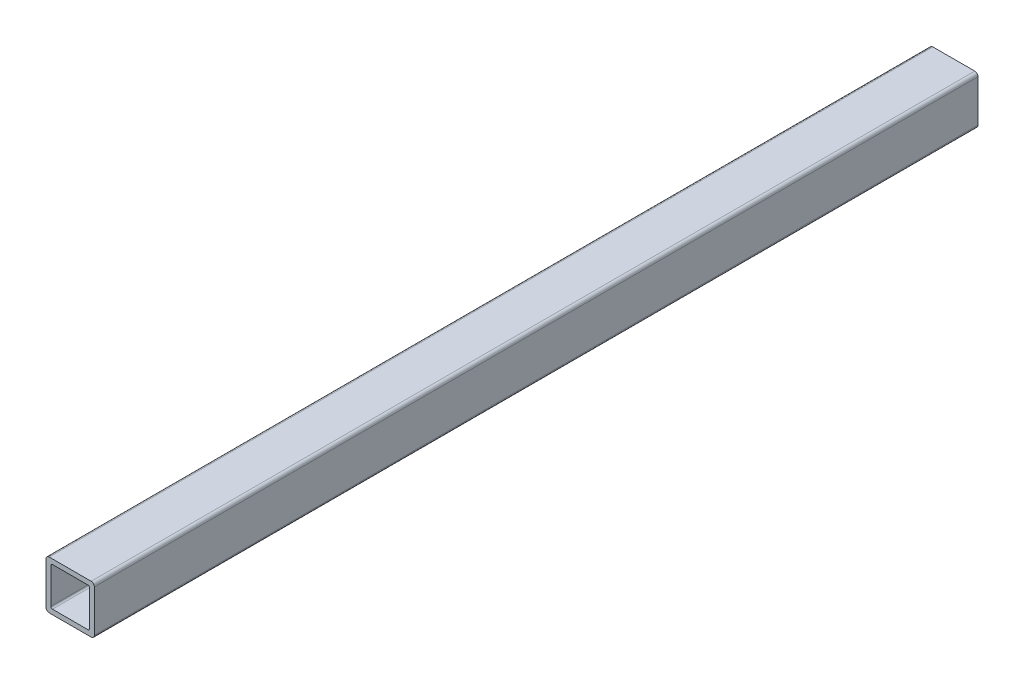
ISO-10303-21;
HEADER;
FILE_DESCRIPTION(('STEP AP214'),'2;1');
FILE_NAME('part.step','',(''),(''),'','','');
FILE_SCHEMA(('AUTOMOTIVE_DESIGN { 1 0 10303 214 1 1 1 1 }'));
ENDSEC;
DATA;
#1=APPLICATION_CONTEXT('core data for automotive mechanical design processes');
#2=APPLICATION_PROTOCOL_DEFINITION('international standard','automotive_design',2000,#1);
#3=PRODUCT_CONTEXT('',#1,'mechanical');
#4=PRODUCT('Part','Part','',(#3));
#5=PRODUCT_RELATED_PRODUCT_CATEGORY('part','',(#4));
#6=PRODUCT_DEFINITION_FORMATION('','',#4);
#7=PRODUCT_DEFINITION_CONTEXT('part definition',#1,'design');
#8=PRODUCT_DEFINITION('design','',#6,#7);
#9=PRODUCT_DEFINITION_SHAPE('','',#8);
#10=(LENGTH_UNIT() NAMED_UNIT(*) SI_UNIT(.MILLI.,.METRE.));
#11=(NAMED_UNIT(*) PLANE_ANGLE_UNIT() SI_UNIT($,.RADIAN.));
#12=(NAMED_UNIT(*) SI_UNIT($,.STERADIAN.) SOLID_ANGLE_UNIT());
#13=UNCERTAINTY_MEASURE_WITH_UNIT(LENGTH_MEASURE(1.E-05),#10,'distance_accuracy_value','');
#14=(GEOMETRIC_REPRESENTATION_CONTEXT(3) GLOBAL_UNCERTAINTY_ASSIGNED_CONTEXT((#13)) GLOBAL_UNIT_ASSIGNED_CONTEXT((#10,
#11,#12)) REPRESENTATION_CONTEXT('',''));
#15=CARTESIAN_POINT('',(0.,0.,0.));
#16=DIRECTION('',(0.,0.,1.));
#17=DIRECTION('',(1.,0.,0.));
#18=AXIS2_PLACEMENT_3D('',#15,#16,#17);
#19=CARTESIAN_POINT('',(2.,2.,548.));
#20=DIRECTION('',(0.,0.,1.));
#21=DIRECTION('',(1.,0.,0.));
#22=AXIS2_PLACEMENT_3D('',#19,#20,#21);
#23=PLANE('',#22);
#24=CARTESIAN_POINT('',(2.,2.,548.));
#25=DIRECTION('',(0.,0.,1.));
#26=DIRECTION('',(1.,0.,0.));
#27=AXIS2_PLACEMENT_3D('',#24,#25,#26);
#28=CIRCLE('',#27,2.);
#29=CARTESIAN_POINT('',(0.,2.00000000000001,548.));
#30=VERTEX_POINT('',#29);
#31=CARTESIAN_POINT('',(2.00000000000001,0.,548.));
#32=VERTEX_POINT('',#31);
#33=EDGE_CURVE('E214',#30,#32,#28,.T.);
#34=ORIENTED_EDGE('',*,*,#33,.T.);
#35=DIRECTION('',(1.,0.,0.));
#36=VECTOR('',#35,1.);
#37=CARTESIAN_POINT('',(2.00000000000001,0.,548.));
#38=LINE('',#37,#36);
#39=CARTESIAN_POINT('',(28.,0.,548.));
#40=VERTEX_POINT('',#39);
#41=EDGE_CURVE('E217',#32,#40,#38,.T.);
#42=ORIENTED_EDGE('',*,*,#41,.T.);
#43=CARTESIAN_POINT('',(28.,2.,548.));
#44=DIRECTION('',(0.,0.,1.));
#45=DIRECTION('',(1.,0.,0.));
#46=AXIS2_PLACEMENT_3D('',#43,#44,#45);
#47=CIRCLE('',#46,2.);
#48=CARTESIAN_POINT('',(30.,2.00000000000001,548.));
#49=VERTEX_POINT('',#48);
#50=EDGE_CURVE('E220',#40,#49,#47,.T.);
#51=ORIENTED_EDGE('',*,*,#50,.T.);
#52=DIRECTION('',(0.,1.,0.));
#53=VECTOR('',#52,1.);
#54=CARTESIAN_POINT('',(30.,2.00000000000001,548.));
#55=LINE('',#54,#53);
#56=CARTESIAN_POINT('',(30.,28.,548.));
#57=VERTEX_POINT('',#56);
#58=EDGE_CURVE('E222',#49,#57,#55,.T.);
#59=ORIENTED_EDGE('',*,*,#58,.T.);
#60=CARTESIAN_POINT('',(28.,28.,548.));
#61=DIRECTION('',(0.,0.,1.));
#62=DIRECTION('',(1.,0.,0.));
#63=AXIS2_PLACEMENT_3D('',#60,#61,#62);
#64=CIRCLE('',#63,2.);
#65=CARTESIAN_POINT('',(28.,30.,548.));
#66=VERTEX_POINT('',#65);
#67=EDGE_CURVE('E224',#57,#66,#64,.T.);
#68=ORIENTED_EDGE('',*,*,#67,.T.);
#69=DIRECTION('',(-1.,0.,0.));
#70=VECTOR('',#69,1.);
#71=CARTESIAN_POINT('',(2.00000000000001,30.,548.));
#72=LINE('',#71,#70);
#73=CARTESIAN_POINT('',(2.00000000000001,30.,548.));
#74=VERTEX_POINT('',#73);
#75=EDGE_CURVE('E226',#66,#74,#72,.T.);
#76=ORIENTED_EDGE('',*,*,#75,.T.);
#77=CARTESIAN_POINT('',(2.,28.,548.));
#78=DIRECTION('',(0.,0.,1.));
#79=DIRECTION('',(1.,0.,0.));
#80=AXIS2_PLACEMENT_3D('',#77,#78,#79);
#81=CIRCLE('',#80,2.);
#82=CARTESIAN_POINT('',(0.,28.,548.));
#83=VERTEX_POINT('',#82);
#84=EDGE_CURVE('E228',#74,#83,#81,.T.);
#85=ORIENTED_EDGE('',*,*,#84,.T.);
#86=DIRECTION('',(0.,-1.,0.));
#87=VECTOR('',#86,1.);
#88=CARTESIAN_POINT('',(0.,2.00000000000001,548.));
#89=LINE('',#88,#87);
#90=EDGE_CURVE('E230',#83,#30,#89,.T.);
#91=ORIENTED_EDGE('',*,*,#90,.T.);
#92=EDGE_LOOP('',(#34,#42,#51,#59,#68,#76,#85,#91));
#93=FACE_BOUND('',#92,.T.);
#94=DIRECTION('',(1.,0.,0.));
#95=VECTOR('',#94,1.);
#96=CARTESIAN_POINT('',(4.00000000000001,3.,548.));
#97=LINE('',#96,#95);
#98=CARTESIAN_POINT('',(4.00000000000001,3.,548.));
#99=VERTEX_POINT('',#98);
#100=CARTESIAN_POINT('',(26.,3.,548.));
#101=VERTEX_POINT('',#100);
#102=EDGE_CURVE('E157',#99,#101,#97,.T.);
#103=ORIENTED_EDGE('',*,*,#102,.F.);
#104=CARTESIAN_POINT('',(4.,4.,548.));
#105=DIRECTION('',(0.,0.,1.));
#106=DIRECTION('',(1.,0.,0.));
#107=AXIS2_PLACEMENT_3D('',#104,#105,#106);
#108=CIRCLE('',#107,1.);
#109=CARTESIAN_POINT('',(3.,4.00000000000001,548.));
#110=VERTEX_POINT('',#109);
#111=EDGE_CURVE('E149',#110,#99,#108,.T.);
#112=ORIENTED_EDGE('',*,*,#111,.F.);
#113=DIRECTION('',(0.,-1.,0.));
#114=VECTOR('',#113,1.);
#115=CARTESIAN_POINT('',(3.,4.00000000000001,548.));
#116=LINE('',#115,#114);
#117=CARTESIAN_POINT('',(3.,26.,548.));
#118=VERTEX_POINT('',#117);
#119=EDGE_CURVE('E182',#118,#110,#116,.T.);
#120=ORIENTED_EDGE('',*,*,#119,.F.);
#121=CARTESIAN_POINT('',(4.,26.,548.));
#122=DIRECTION('',(0.,0.,1.));
#123=DIRECTION('',(1.,0.,0.));
#124=AXIS2_PLACEMENT_3D('',#121,#122,#123);
#125=CIRCLE('',#124,1.);
#126=CARTESIAN_POINT('',(4.00000000000001,27.,548.));
#127=VERTEX_POINT('',#126);
#128=EDGE_CURVE('E180',#127,#118,#125,.T.);
#129=ORIENTED_EDGE('',*,*,#128,.F.);
#130=DIRECTION('',(-1.,0.,0.));
#131=VECTOR('',#130,1.);
#132=CARTESIAN_POINT('',(4.00000000000001,27.,548.));
#133=LINE('',#132,#131);
#134=CARTESIAN_POINT('',(26.,27.,548.));
#135=VERTEX_POINT('',#134);
#136=EDGE_CURVE('E178',#135,#127,#133,.T.);
#137=ORIENTED_EDGE('',*,*,#136,.F.);
#138=CARTESIAN_POINT('',(26.,26.,548.));
#139=DIRECTION('',(0.,0.,1.));
#140=DIRECTION('',(1.,0.,0.));
#141=AXIS2_PLACEMENT_3D('',#138,#139,#140);
#142=CIRCLE('',#141,1.);
#143=CARTESIAN_POINT('',(27.,26.,548.));
#144=VERTEX_POINT('',#143);
#145=EDGE_CURVE('E176',#144,#135,#142,.T.);
#146=ORIENTED_EDGE('',*,*,#145,.F.);
#147=DIRECTION('',(0.,1.,0.));
#148=VECTOR('',#147,1.);
#149=CARTESIAN_POINT('',(27.,4.00000000000001,548.));
#150=LINE('',#149,#148);
#151=CARTESIAN_POINT('',(27.,4.00000000000001,548.));
#152=VERTEX_POINT('',#151);
#153=EDGE_CURVE('E172',#152,#144,#150,.T.);
#154=ORIENTED_EDGE('',*,*,#153,.F.);
#155=CARTESIAN_POINT('',(26.,4.,548.));
#156=DIRECTION('',(0.,0.,1.));
#157=DIRECTION('',(1.,0.,0.));
#158=AXIS2_PLACEMENT_3D('',#155,#156,#157);
#159=CIRCLE('',#158,1.);
#160=EDGE_CURVE('E170',#101,#152,#159,.T.);
#161=ORIENTED_EDGE('',*,*,#160,.F.);
#162=EDGE_LOOP('',(#103,#112,#120,#129,#137,#146,#154,#161));
#163=FACE_BOUND('',#162,.T.);
#164=ADVANCED_FACE('F36',(#93,#163),#23,.T.);
#165=CARTESIAN_POINT('',(2.,2.,0.));
#166=DIRECTION('',(0.,0.,1.));
#167=DIRECTION('',(1.,0.,0.));
#168=AXIS2_PLACEMENT_3D('',#165,#166,#167);
#169=PLANE('',#168);
#170=CARTESIAN_POINT('',(2.,2.,0.));
#171=DIRECTION('',(0.,0.,1.));
#172=DIRECTION('',(1.,0.,0.));
#173=AXIS2_PLACEMENT_3D('',#170,#171,#172);
#174=CIRCLE('',#173,2.);
#175=CARTESIAN_POINT('',(0.,2.00000000000001,0.));
#176=VERTEX_POINT('',#175);
#177=CARTESIAN_POINT('',(2.00000000000001,0.,0.));
#178=VERTEX_POINT('',#177);
#179=EDGE_CURVE('E165',#176,#178,#174,.T.);
#180=ORIENTED_EDGE('',*,*,#179,.F.);
#181=DIRECTION('',(0.,-1.,0.));
#182=VECTOR('',#181,1.);
#183=CARTESIAN_POINT('',(0.,2.00000000000001,0.));
#184=LINE('',#183,#182);
#185=CARTESIAN_POINT('',(0.,28.,0.));
#186=VERTEX_POINT('',#185);
#187=EDGE_CURVE('E218',#186,#176,#184,.T.);
#188=ORIENTED_EDGE('',*,*,#187,.F.);
#189=CARTESIAN_POINT('',(2.,28.,0.));
#190=DIRECTION('',(0.,0.,1.));
#191=DIRECTION('',(1.,0.,0.));
#192=AXIS2_PLACEMENT_3D('',#189,#190,#191);
#193=CIRCLE('',#192,2.);
#194=CARTESIAN_POINT('',(2.00000000000001,30.,0.));
#195=VERTEX_POINT('',#194);
#196=EDGE_CURVE('E245',#195,#186,#193,.T.);
#197=ORIENTED_EDGE('',*,*,#196,.F.);
#198=DIRECTION('',(-1.,0.,0.));
#199=VECTOR('',#198,1.);
#200=CARTESIAN_POINT('',(2.00000000000001,30.,0.));
#201=LINE('',#200,#199);
#202=CARTESIAN_POINT('',(28.,30.,0.));
#203=VERTEX_POINT('',#202);
#204=EDGE_CURVE('E243',#203,#195,#201,.T.);
#205=ORIENTED_EDGE('',*,*,#204,.F.);
#206=CARTESIAN_POINT('',(28.,28.,0.));
#207=DIRECTION('',(0.,0.,1.));
#208=DIRECTION('',(1.,0.,0.));
#209=AXIS2_PLACEMENT_3D('',#206,#207,#208);
#210=CIRCLE('',#209,2.);
#211=CARTESIAN_POINT('',(30.,28.,0.));
#212=VERTEX_POINT('',#211);
#213=EDGE_CURVE('E241',#212,#203,#210,.T.);
#214=ORIENTED_EDGE('',*,*,#213,.F.);
#215=DIRECTION('',(0.,1.,0.));
#216=VECTOR('',#215,1.);
#217=CARTESIAN_POINT('',(30.,2.00000000000001,0.));
#218=LINE('',#217,#216);
#219=CARTESIAN_POINT('',(30.,2.00000000000001,0.));
#220=VERTEX_POINT('',#219);
#221=EDGE_CURVE('E239',#220,#212,#218,.T.);
#222=ORIENTED_EDGE('',*,*,#221,.F.);
#223=CARTESIAN_POINT('',(28.,2.,0.));
#224=DIRECTION('',(0.,0.,1.));
#225=DIRECTION('',(1.,0.,0.));
#226=AXIS2_PLACEMENT_3D('',#223,#224,#225);
#227=CIRCLE('',#226,2.);
#228=CARTESIAN_POINT('',(28.,0.,0.));
#229=VERTEX_POINT('',#228);
#230=EDGE_CURVE('E237',#229,#220,#227,.T.);
#231=ORIENTED_EDGE('',*,*,#230,.F.);
#232=DIRECTION('',(1.,0.,0.));
#233=VECTOR('',#232,1.);
#234=CARTESIAN_POINT('',(2.00000000000001,0.,0.));
#235=LINE('',#234,#233);
#236=EDGE_CURVE('E235',#178,#229,#235,.T.);
#237=ORIENTED_EDGE('',*,*,#236,.F.);
#238=EDGE_LOOP('',(#180,#188,#197,#205,#214,#222,#231,#237));
#239=FACE_BOUND('',#238,.T.);
#240=CARTESIAN_POINT('',(4.,4.,0.));
#241=DIRECTION('',(0.,0.,1.));
#242=DIRECTION('',(1.,0.,0.));
#243=AXIS2_PLACEMENT_3D('',#240,#241,#242);
#244=CIRCLE('',#243,1.);
#245=CARTESIAN_POINT('',(3.,4.00000000000001,0.));
#246=VERTEX_POINT('',#245);
#247=CARTESIAN_POINT('',(4.00000000000001,3.,0.));
#248=VERTEX_POINT('',#247);
#249=EDGE_CURVE('E59',#246,#248,#244,.T.);
#250=ORIENTED_EDGE('',*,*,#249,.T.);
#251=DIRECTION('',(1.,0.,0.));
#252=VECTOR('',#251,1.);
#253=CARTESIAN_POINT('',(4.00000000000001,3.,0.));
#254=LINE('',#253,#252);
#255=CARTESIAN_POINT('',(26.,3.,0.));
#256=VERTEX_POINT('',#255);
#257=EDGE_CURVE('E164',#248,#256,#254,.T.);
#258=ORIENTED_EDGE('',*,*,#257,.T.);
#259=CARTESIAN_POINT('',(26.,4.,0.));
#260=DIRECTION('',(0.,0.,1.));
#261=DIRECTION('',(1.,0.,0.));
#262=AXIS2_PLACEMENT_3D('',#259,#260,#261);
#263=CIRCLE('',#262,1.);
#264=CARTESIAN_POINT('',(27.,4.00000000000001,0.));
#265=VERTEX_POINT('',#264);
#266=EDGE_CURVE('E186',#256,#265,#263,.T.);
#267=ORIENTED_EDGE('',*,*,#266,.T.);
#268=DIRECTION('',(0.,1.,0.));
#269=VECTOR('',#268,1.);
#270=CARTESIAN_POINT('',(27.,4.00000000000001,0.));
#271=LINE('',#270,#269);
#272=CARTESIAN_POINT('',(27.,26.,0.));
#273=VERTEX_POINT('',#272);
#274=EDGE_CURVE('E189',#265,#273,#271,.T.);
#275=ORIENTED_EDGE('',*,*,#274,.T.);
#276=CARTESIAN_POINT('',(26.,26.,0.));
#277=DIRECTION('',(0.,0.,1.));
#278=DIRECTION('',(1.,0.,0.));
#279=AXIS2_PLACEMENT_3D('',#276,#277,#278);
#280=CIRCLE('',#279,1.);
#281=CARTESIAN_POINT('',(26.,27.,0.));
#282=VERTEX_POINT('',#281);
#283=EDGE_CURVE('E192',#273,#282,#280,.T.);
#284=ORIENTED_EDGE('',*,*,#283,.T.);
#285=DIRECTION('',(-1.,0.,0.));
#286=VECTOR('',#285,1.);
#287=CARTESIAN_POINT('',(4.00000000000001,27.,0.));
#288=LINE('',#287,#286);
#289=CARTESIAN_POINT('',(4.00000000000001,27.,0.));
#290=VERTEX_POINT('',#289);
#291=EDGE_CURVE('E195',#282,#290,#288,.T.);
#292=ORIENTED_EDGE('',*,*,#291,.T.);
#293=CARTESIAN_POINT('',(4.,26.,0.));
#294=DIRECTION('',(0.,0.,1.));
#295=DIRECTION('',(1.,0.,0.));
#296=AXIS2_PLACEMENT_3D('',#293,#294,#295);
#297=CIRCLE('',#296,1.);
#298=CARTESIAN_POINT('',(3.,26.,0.));
#299=VERTEX_POINT('',#298);
#300=EDGE_CURVE('E198',#290,#299,#297,.T.);
#301=ORIENTED_EDGE('',*,*,#300,.T.);
#302=DIRECTION('',(0.,-1.,0.));
#303=VECTOR('',#302,1.);
#304=CARTESIAN_POINT('',(3.,4.00000000000001,0.));
#305=LINE('',#304,#303);
#306=EDGE_CURVE('E158',#299,#246,#305,.T.);
#307=ORIENTED_EDGE('',*,*,#306,.T.);
#308=EDGE_LOOP('',(#250,#258,#267,#275,#284,#292,#301,#307));
#309=FACE_BOUND('',#308,.T.);
#310=ADVANCED_FACE('F275',(#239,#309),#169,.F.);
#311=CARTESIAN_POINT('',(2.,2.,548.));
#312=DIRECTION('',(0.,0.,-1.));
#313=DIRECTION('',(-1.,0.,0.));
#314=AXIS2_PLACEMENT_3D('',#311,#312,#313);
#315=CYLINDRICAL_SURFACE('',#314,2.);
#316=ORIENTED_EDGE('',*,*,#179,.T.);
#317=DIRECTION('',(0.,0.,-1.));
#318=VECTOR('',#317,1.);
#319=CARTESIAN_POINT('',(2.00000000000001,0.,548.));
#320=LINE('',#319,#318);
#321=EDGE_CURVE('E11',#32,#178,#320,.T.);
#322=ORIENTED_EDGE('',*,*,#321,.F.);
#323=ORIENTED_EDGE('',*,*,#33,.F.);
#324=DIRECTION('',(0.,0.,-1.));
#325=VECTOR('',#324,1.);
#326=CARTESIAN_POINT('',(0.,2.00000000000001,548.));
#327=LINE('',#326,#325);
#328=EDGE_CURVE('E232',#30,#176,#327,.T.);
#329=ORIENTED_EDGE('',*,*,#328,.T.);
#330=EDGE_LOOP('',(#316,#322,#323,#329));
#331=FACE_BOUND('',#330,.T.);
#332=ADVANCED_FACE('F38',(#331),#315,.T.);
#333=CARTESIAN_POINT('',(2.00000000000001,0.,548.));
#334=DIRECTION('',(0.,1.,0.));
#335=DIRECTION('',(0.,0.,1.));
#336=AXIS2_PLACEMENT_3D('',#333,#334,#335);
#337=PLANE('',#336);
#338=ORIENTED_EDGE('',*,*,#236,.T.);
#339=DIRECTION('',(0.,0.,-1.));
#340=VECTOR('',#339,1.);
#341=CARTESIAN_POINT('',(28.,0.,548.));
#342=LINE('',#341,#340);
#343=EDGE_CURVE('E44',#40,#229,#342,.T.);
#344=ORIENTED_EDGE('',*,*,#343,.F.);
#345=ORIENTED_EDGE('',*,*,#41,.F.);
#346=ORIENTED_EDGE('',*,*,#321,.T.);
#347=EDGE_LOOP('',(#338,#344,#345,#346));
#348=FACE_BOUND('',#347,.T.);
#349=ADVANCED_FACE('F292',(#348),#337,.F.);
#350=CARTESIAN_POINT('',(28.,2.,548.));
#351=DIRECTION('',(0.,0.,-1.));
#352=DIRECTION('',(-1.,0.,0.));
#353=AXIS2_PLACEMENT_3D('',#350,#351,#352);
#354=CYLINDRICAL_SURFACE('',#353,2.);
#355=ORIENTED_EDGE('',*,*,#230,.T.);
#356=DIRECTION('',(0.,0.,-1.));
#357=VECTOR('',#356,1.);
#358=CARTESIAN_POINT('',(30.,2.00000000000001,548.));
#359=LINE('',#358,#357);
#360=EDGE_CURVE('E262',#49,#220,#359,.T.);
#361=ORIENTED_EDGE('',*,*,#360,.F.);
#362=ORIENTED_EDGE('',*,*,#50,.F.);
#363=ORIENTED_EDGE('',*,*,#343,.T.);
#364=EDGE_LOOP('',(#355,#361,#362,#363));
#365=FACE_BOUND('',#364,.T.);
#366=ADVANCED_FACE('F269',(#365),#354,.T.);
#367=CARTESIAN_POINT('',(30.,2.00000000000001,548.));
#368=DIRECTION('',(-1.,0.,0.));
#369=DIRECTION('',(0.,0.,1.));
#370=AXIS2_PLACEMENT_3D('',#367,#368,#369);
#371=PLANE('',#370);
#372=ORIENTED_EDGE('',*,*,#221,.T.);
#373=DIRECTION('',(0.,0.,-1.));
#374=VECTOR('',#373,1.);
#375=CARTESIAN_POINT('',(30.,28.,548.));
#376=LINE('',#375,#374);
#377=EDGE_CURVE('E259',#57,#212,#376,.T.);
#378=ORIENTED_EDGE('',*,*,#377,.F.);
#379=ORIENTED_EDGE('',*,*,#58,.F.);
#380=ORIENTED_EDGE('',*,*,#360,.T.);
#381=EDGE_LOOP('',(#372,#378,#379,#380));
#382=FACE_BOUND('',#381,.T.);
#383=ADVANCED_FACE('F281',(#382),#371,.F.);
#384=CARTESIAN_POINT('',(28.,28.,548.));
#385=DIRECTION('',(0.,0.,-1.));
#386=DIRECTION('',(-1.,0.,0.));
#387=AXIS2_PLACEMENT_3D('',#384,#385,#386);
#388=CYLINDRICAL_SURFACE('',#387,2.);
#389=ORIENTED_EDGE('',*,*,#213,.T.);
#390=DIRECTION('',(0.,0.,-1.));
#391=VECTOR('',#390,1.);
#392=CARTESIAN_POINT('',(28.,30.,548.));
#393=LINE('',#392,#391);
#394=EDGE_CURVE('E256',#66,#203,#393,.T.);
#395=ORIENTED_EDGE('',*,*,#394,.F.);
#396=ORIENTED_EDGE('',*,*,#67,.F.);
#397=ORIENTED_EDGE('',*,*,#377,.T.);
#398=EDGE_LOOP('',(#389,#395,#396,#397));
#399=FACE_BOUND('',#398,.T.);
#400=ADVANCED_FACE('F285',(#399),#388,.T.);
#401=CARTESIAN_POINT('',(2.00000000000001,30.,548.));
#402=DIRECTION('',(0.,-1.,0.));
#403=DIRECTION('',(0.,0.,-1.));
#404=AXIS2_PLACEMENT_3D('',#401,#402,#403);
#405=PLANE('',#404);
#406=ORIENTED_EDGE('',*,*,#204,.T.);
#407=DIRECTION('',(0.,0.,-1.));
#408=VECTOR('',#407,1.);
#409=CARTESIAN_POINT('',(2.00000000000001,30.,548.));
#410=LINE('',#409,#408);
#411=EDGE_CURVE('E253',#74,#195,#410,.T.);
#412=ORIENTED_EDGE('',*,*,#411,.F.);
#413=ORIENTED_EDGE('',*,*,#75,.F.);
#414=ORIENTED_EDGE('',*,*,#394,.T.);
#415=EDGE_LOOP('',(#406,#412,#413,#414));
#416=FACE_BOUND('',#415,.T.);
#417=ADVANCED_FACE('F305',(#416),#405,.F.);
#418=CARTESIAN_POINT('',(2.,28.,548.));
#419=DIRECTION('',(0.,0.,-1.));
#420=DIRECTION('',(-1.,0.,0.));
#421=AXIS2_PLACEMENT_3D('',#418,#419,#420);
#422=CYLINDRICAL_SURFACE('',#421,2.);
#423=ORIENTED_EDGE('',*,*,#196,.T.);
#424=DIRECTION('',(0.,0.,-1.));
#425=VECTOR('',#424,1.);
#426=CARTESIAN_POINT('',(0.,28.,548.));
#427=LINE('',#426,#425);
#428=EDGE_CURVE('E250',#83,#186,#427,.T.);
#429=ORIENTED_EDGE('',*,*,#428,.F.);
#430=ORIENTED_EDGE('',*,*,#84,.F.);
#431=ORIENTED_EDGE('',*,*,#411,.T.);
#432=EDGE_LOOP('',(#423,#429,#430,#431));
#433=FACE_BOUND('',#432,.T.);
#434=ADVANCED_FACE('F303',(#433),#422,.T.);
#435=CARTESIAN_POINT('',(0.,2.00000000000001,548.));
#436=DIRECTION('',(1.,0.,0.));
#437=DIRECTION('',(0.,0.,-1.));
#438=AXIS2_PLACEMENT_3D('',#435,#436,#437);
#439=PLANE('',#438);
#440=ORIENTED_EDGE('',*,*,#187,.T.);
#441=ORIENTED_EDGE('',*,*,#328,.F.);
#442=ORIENTED_EDGE('',*,*,#90,.F.);
#443=ORIENTED_EDGE('',*,*,#428,.T.);
#444=EDGE_LOOP('',(#440,#441,#442,#443));
#445=FACE_BOUND('',#444,.T.);
#446=ADVANCED_FACE('F298',(#445),#439,.F.);
#447=CARTESIAN_POINT('',(4.,4.,548.));
#448=DIRECTION('',(0.,0.,-1.));
#449=DIRECTION('',(-1.,0.,0.));
#450=AXIS2_PLACEMENT_3D('',#447,#448,#449);
#451=CYLINDRICAL_SURFACE('',#450,1.);
#452=ORIENTED_EDGE('',*,*,#249,.F.);
#453=DIRECTION('',(0.,0.,-1.));
#454=VECTOR('',#453,1.);
#455=CARTESIAN_POINT('',(3.,4.00000000000001,548.));
#456=LINE('',#455,#454);
#457=EDGE_CURVE('E153',#110,#246,#456,.T.);
#458=ORIENTED_EDGE('',*,*,#457,.F.);
#459=ORIENTED_EDGE('',*,*,#111,.T.);
#460=DIRECTION('',(0.,0.,-1.));
#461=VECTOR('',#460,1.);
#462=CARTESIAN_POINT('',(4.00000000000001,3.,548.));
#463=LINE('',#462,#461);
#464=EDGE_CURVE('E152',#99,#248,#463,.T.);
#465=ORIENTED_EDGE('',*,*,#464,.T.);
#466=EDGE_LOOP('',(#452,#458,#459,#465));
#467=FACE_BOUND('',#466,.T.);
#468=ADVANCED_FACE('F151',(#467),#451,.F.);
#469=CARTESIAN_POINT('',(4.00000000000001,3.,548.));
#470=DIRECTION('',(0.,1.,0.));
#471=DIRECTION('',(-1.,0.,0.));
#472=AXIS2_PLACEMENT_3D('',#469,#470,#471);
#473=PLANE('',#472);
#474=ORIENTED_EDGE('',*,*,#257,.F.);
#475=ORIENTED_EDGE('',*,*,#464,.F.);
#476=ORIENTED_EDGE('',*,*,#102,.T.);
#477=DIRECTION('',(0.,0.,-1.));
#478=VECTOR('',#477,1.);
#479=CARTESIAN_POINT('',(26.,3.,548.));
#480=LINE('',#479,#478);
#481=EDGE_CURVE('E166',#101,#256,#480,.T.);
#482=ORIENTED_EDGE('',*,*,#481,.T.);
#483=EDGE_LOOP('',(#474,#475,#476,#482));
#484=FACE_BOUND('',#483,.T.);
#485=ADVANCED_FACE('F161',(#484),#473,.T.);
#486=CARTESIAN_POINT('',(26.,4.,548.));
#487=DIRECTION('',(0.,0.,-1.));
#488=DIRECTION('',(-1.,0.,0.));
#489=AXIS2_PLACEMENT_3D('',#486,#487,#488);
#490=CYLINDRICAL_SURFACE('',#489,1.);
#491=ORIENTED_EDGE('',*,*,#266,.F.);
#492=ORIENTED_EDGE('',*,*,#481,.F.);
#493=ORIENTED_EDGE('',*,*,#160,.T.);
#494=DIRECTION('',(0.,0.,-1.));
#495=VECTOR('',#494,1.);
#496=CARTESIAN_POINT('',(27.,4.00000000000001,548.));
#497=LINE('',#496,#495);
#498=EDGE_CURVE('E211',#152,#265,#497,.T.);
#499=ORIENTED_EDGE('',*,*,#498,.T.);
#500=EDGE_LOOP('',(#491,#492,#493,#499));
#501=FACE_BOUND('',#500,.T.);
#502=ADVANCED_FACE('F330',(#501),#490,.F.);
#503=CARTESIAN_POINT('',(27.,4.00000000000001,548.));
#504=DIRECTION('',(-1.,0.,0.));
#505=DIRECTION('',(0.,0.,1.));
#506=AXIS2_PLACEMENT_3D('',#503,#504,#505);
#507=PLANE('',#506);
#508=ORIENTED_EDGE('',*,*,#274,.F.);
#509=ORIENTED_EDGE('',*,*,#498,.F.);
#510=ORIENTED_EDGE('',*,*,#153,.T.);
#511=DIRECTION('',(0.,0.,-1.));
#512=VECTOR('',#511,1.);
#513=CARTESIAN_POINT('',(27.,26.,548.));
#514=LINE('',#513,#512);
#515=EDGE_CURVE('E209',#144,#273,#514,.T.);
#516=ORIENTED_EDGE('',*,*,#515,.T.);
#517=EDGE_LOOP('',(#508,#509,#510,#516));
#518=FACE_BOUND('',#517,.T.);
#519=ADVANCED_FACE('F334',(#518),#507,.T.);
#520=CARTESIAN_POINT('',(26.,26.,548.));
#521=DIRECTION('',(0.,0.,-1.));
#522=DIRECTION('',(-1.,0.,0.));
#523=AXIS2_PLACEMENT_3D('',#520,#521,#522);
#524=CYLINDRICAL_SURFACE('',#523,1.);
#525=ORIENTED_EDGE('',*,*,#283,.F.);
#526=ORIENTED_EDGE('',*,*,#515,.F.);
#527=ORIENTED_EDGE('',*,*,#145,.T.);
#528=DIRECTION('',(0.,0.,-1.));
#529=VECTOR('',#528,1.);
#530=CARTESIAN_POINT('',(26.,27.,548.));
#531=LINE('',#530,#529);
#532=EDGE_CURVE('E207',#135,#282,#531,.T.);
#533=ORIENTED_EDGE('',*,*,#532,.T.);
#534=EDGE_LOOP('',(#525,#526,#527,#533));
#535=FACE_BOUND('',#534,.T.);
#536=ADVANCED_FACE('F340',(#535),#524,.F.);
#537=CARTESIAN_POINT('',(4.00000000000001,27.,548.));
#538=DIRECTION('',(0.,-1.,0.));
#539=DIRECTION('',(0.,0.,-1.));
#540=AXIS2_PLACEMENT_3D('',#537,#538,#539);
#541=PLANE('',#540);
#542=ORIENTED_EDGE('',*,*,#291,.F.);
#543=ORIENTED_EDGE('',*,*,#532,.F.);
#544=ORIENTED_EDGE('',*,*,#136,.T.);
#545=DIRECTION('',(0.,0.,-1.));
#546=VECTOR('',#545,1.);
#547=CARTESIAN_POINT('',(4.00000000000001,27.,548.));
#548=LINE('',#547,#546);
#549=EDGE_CURVE('E205',#127,#290,#548,.T.);
#550=ORIENTED_EDGE('',*,*,#549,.T.);
#551=EDGE_LOOP('',(#542,#543,#544,#550));
#552=FACE_BOUND('',#551,.T.);
#553=ADVANCED_FACE('F344',(#552),#541,.T.);
#554=CARTESIAN_POINT('',(4.,26.,548.));
#555=DIRECTION('',(0.,0.,-1.));
#556=DIRECTION('',(-1.,0.,0.));
#557=AXIS2_PLACEMENT_3D('',#554,#555,#556);
#558=CYLINDRICAL_SURFACE('',#557,1.);
#559=ORIENTED_EDGE('',*,*,#300,.F.);
#560=ORIENTED_EDGE('',*,*,#549,.F.);
#561=ORIENTED_EDGE('',*,*,#128,.T.);
#562=DIRECTION('',(0.,0.,-1.));
#563=VECTOR('',#562,1.);
#564=CARTESIAN_POINT('',(3.,26.,548.));
#565=LINE('',#564,#563);
#566=EDGE_CURVE('E51',#118,#299,#565,.T.);
#567=ORIENTED_EDGE('',*,*,#566,.T.);
#568=EDGE_LOOP('',(#559,#560,#561,#567));
#569=FACE_BOUND('',#568,.T.);
#570=ADVANCED_FACE('F348',(#569),#558,.F.);
#571=CARTESIAN_POINT('',(3.,4.00000000000001,548.));
#572=DIRECTION('',(1.,0.,0.));
#573=DIRECTION('',(0.,0.,-1.));
#574=AXIS2_PLACEMENT_3D('',#571,#572,#573);
#575=PLANE('',#574);
#576=ORIENTED_EDGE('',*,*,#306,.F.);
#577=ORIENTED_EDGE('',*,*,#566,.F.);
#578=ORIENTED_EDGE('',*,*,#119,.T.);
#579=ORIENTED_EDGE('',*,*,#457,.T.);
#580=EDGE_LOOP('',(#576,#577,#578,#579));
#581=FACE_BOUND('',#580,.T.);
#582=ADVANCED_FACE('F352',(#581),#575,.T.);
#583=CLOSED_SHELL('',(#164,#310,#332,#349,#366,#383,#400,#417,#434,#446,#468,#485,#502,#519,
#536,#553,#570,#582));
#584=MANIFOLD_SOLID_BREP('B2',#583);
#585=ADVANCED_BREP_SHAPE_REPRESENTATION('',(#18,#584),#14);
#586=SHAPE_DEFINITION_REPRESENTATION(#9,#585);
ENDSEC;
END-ISO-10303-21;
